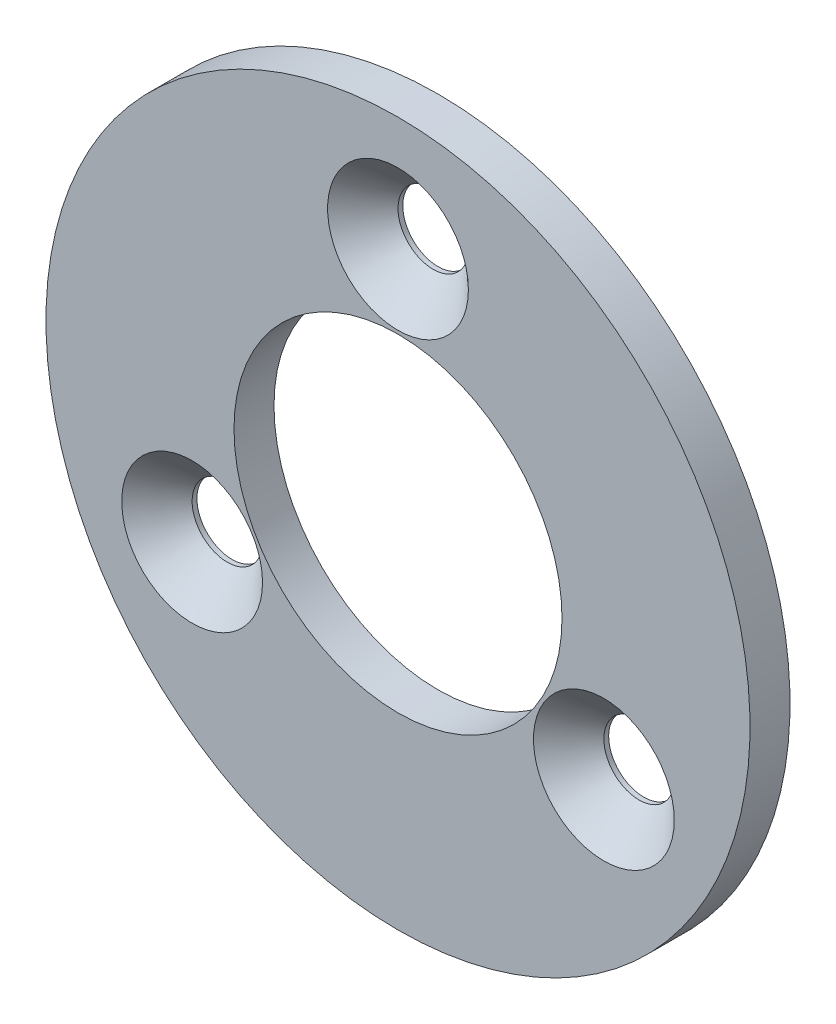
ISO-10303-21;
HEADER;
FILE_DESCRIPTION(('STEP AP214'),'2;1');
FILE_NAME('part.step','',(''),(''),'','','');
FILE_SCHEMA(('AUTOMOTIVE_DESIGN { 1 0 10303 214 1 1 1 1 }'));
ENDSEC;
DATA;
#1=APPLICATION_CONTEXT('core data for automotive mechanical design processes');
#2=APPLICATION_PROTOCOL_DEFINITION('international standard','automotive_design',2000,#1);
#3=PRODUCT_CONTEXT('',#1,'mechanical');
#4=PRODUCT('Part','Part','',(#3));
#5=PRODUCT_RELATED_PRODUCT_CATEGORY('part','',(#4));
#6=PRODUCT_DEFINITION_FORMATION('','',#4);
#7=PRODUCT_DEFINITION_CONTEXT('part definition',#1,'design');
#8=PRODUCT_DEFINITION('design','',#6,#7);
#9=PRODUCT_DEFINITION_SHAPE('','',#8);
#10=(LENGTH_UNIT() NAMED_UNIT(*) SI_UNIT(.MILLI.,.METRE.));
#11=(NAMED_UNIT(*) PLANE_ANGLE_UNIT() SI_UNIT($,.RADIAN.));
#12=(NAMED_UNIT(*) SI_UNIT($,.STERADIAN.) SOLID_ANGLE_UNIT());
#13=UNCERTAINTY_MEASURE_WITH_UNIT(LENGTH_MEASURE(1.E-05),#10,'distance_accuracy_value','');
#14=(GEOMETRIC_REPRESENTATION_CONTEXT(3) GLOBAL_UNCERTAINTY_ASSIGNED_CONTEXT((#13)) GLOBAL_UNIT_ASSIGNED_CONTEXT((#10,
#11,#12)) REPRESENTATION_CONTEXT('',''));
#15=CARTESIAN_POINT('',(0.,0.,0.));
#16=DIRECTION('',(0.,0.,1.));
#17=DIRECTION('',(1.,0.,0.));
#18=AXIS2_PLACEMENT_3D('',#15,#16,#17);
#19=CARTESIAN_POINT('',(0.,7.42820323027551,1.25000000002728));
#20=DIRECTION('',(0.,0.,1.));
#21=DIRECTION('',(1.,0.,0.));
#22=AXIS2_PLACEMENT_3D('',#19,#20,#21);
#23=CONICAL_SURFACE('',#22,2.1999999999025,0.78539816337161);
#24=CARTESIAN_POINT('',(0.,7.42820323027551,0.150000000000011));
#25=DIRECTION('',(0.,0.,1.));
#26=DIRECTION('',(0.,-1.,0.));
#27=AXIS2_PLACEMENT_3D('',#24,#25,#26);
#28=CIRCLE('',#27,1.1);
#29=CARTESIAN_POINT('',(0.,6.32820323027552,0.150000000000011));
#30=VERTEX_POINT('',#29);
#31=EDGE_CURVE('E30',#30,#30,#28,.F.);
#32=ORIENTED_EDGE('',*,*,#31,.T.);
#33=EDGE_LOOP('',(#32));
#34=FACE_BOUND('',#33,.T.);
#35=CARTESIAN_POINT('',(0.,7.42820323027551,1.25000000002728));
#36=DIRECTION('',(0.,0.,1.));
#37=DIRECTION('',(1.,0.,0.));
#38=AXIS2_PLACEMENT_3D('',#35,#36,#37);
#39=CIRCLE('',#38,2.1999999999025);
#40=CARTESIAN_POINT('',(2.1999999999025,7.42820323027551,1.25000000002728));
#41=VERTEX_POINT('',#40);
#42=EDGE_CURVE('E18',#41,#41,#39,.F.);
#43=ORIENTED_EDGE('',*,*,#42,.F.);
#44=EDGE_LOOP('',(#43));
#45=FACE_BOUND('',#44,.T.);
#46=ADVANCED_FACE('F15',(#34,#45),#23,.F.);
#47=CARTESIAN_POINT('',(6.43301270189222,-3.71410161513775,1.2499999999136));
#48=DIRECTION('',(0.,0.,1.));
#49=DIRECTION('',(1.,0.,0.));
#50=AXIS2_PLACEMENT_3D('',#47,#48,#49);
#51=CONICAL_SURFACE('',#50,2.19999999985821,0.785398163397448);
#52=CARTESIAN_POINT('',(6.43301270189222,-3.71410161513775,0.150000000000011));
#53=DIRECTION('',(0.,0.,1.));
#54=DIRECTION('',(0.,-1.,0.));
#55=AXIS2_PLACEMENT_3D('',#52,#53,#54);
#56=CIRCLE('',#55,1.1);
#57=CARTESIAN_POINT('',(6.43301270189222,-4.81410161513775,0.150000000000011));
#58=VERTEX_POINT('',#57);
#59=EDGE_CURVE('E109',#58,#58,#56,.F.);
#60=ORIENTED_EDGE('',*,*,#59,.T.);
#61=EDGE_LOOP('',(#60));
#62=FACE_BOUND('',#61,.T.);
#63=CARTESIAN_POINT('',(6.43301270189222,-3.71410161513775,1.24999999995789));
#64=DIRECTION('',(0.,0.,1.));
#65=DIRECTION('',(1.,0.,0.));
#66=AXIS2_PLACEMENT_3D('',#63,#64,#65);
#67=CIRCLE('',#66,2.1999999999025);
#68=CARTESIAN_POINT('',(8.63301270179473,-3.71410161513775,1.24999999995789));
#69=VERTEX_POINT('',#68);
#70=EDGE_CURVE('E50',#69,#69,#67,.F.);
#71=ORIENTED_EDGE('',*,*,#70,.F.);
#72=EDGE_LOOP('',(#71));
#73=FACE_BOUND('',#72,.T.);
#74=ADVANCED_FACE('F60',(#62,#73),#51,.F.);
#75=CARTESIAN_POINT('',(-6.43301270189222,-3.71410161513776,1.24999999997044));
#76=DIRECTION('',(0.,0.,1.));
#77=DIRECTION('',(1.,0.,0.));
#78=AXIS2_PLACEMENT_3D('',#75,#76,#77);
#79=CONICAL_SURFACE('',#78,2.20000000000363,0.785398163423286);
#80=CARTESIAN_POINT('',(-6.43301270189222,-3.71410161513776,0.150000000000011));
#81=DIRECTION('',(0.,0.,1.));
#82=DIRECTION('',(0.,-1.,0.));
#83=AXIS2_PLACEMENT_3D('',#80,#81,#82);
#84=CIRCLE('',#83,1.1);
#85=CARTESIAN_POINT('',(-6.43301270189222,-4.81410161513775,0.150000000000011));
#86=VERTEX_POINT('',#85);
#87=EDGE_CURVE('E47',#86,#86,#84,.F.);
#88=ORIENTED_EDGE('',*,*,#87,.T.);
#89=EDGE_LOOP('',(#88));
#90=FACE_BOUND('',#89,.T.);
#91=CARTESIAN_POINT('',(-6.43301270189222,-3.71410161513776,1.25000000003984));
#92=DIRECTION('',(0.,0.,1.));
#93=DIRECTION('',(1.,0.,0.));
#94=AXIS2_PLACEMENT_3D('',#91,#92,#93);
#95=CIRCLE('',#94,2.20000000007303);
#96=CARTESIAN_POINT('',(-4.23301270181919,-3.71410161513776,1.25000000003984));
#97=VERTEX_POINT('',#96);
#98=EDGE_CURVE('E48',#97,#97,#95,.F.);
#99=ORIENTED_EDGE('',*,*,#98,.F.);
#100=EDGE_LOOP('',(#99));
#101=FACE_BOUND('',#100,.T.);
#102=ADVANCED_FACE('F66',(#90,#101),#79,.F.);
#103=CARTESIAN_POINT('',(0.,0.,1.25));
#104=DIRECTION('',(0.,0.,1.));
#105=DIRECTION('',(0.,-1.,0.));
#106=AXIS2_PLACEMENT_3D('',#103,#104,#105);
#107=PLANE('',#106);
#108=CARTESIAN_POINT('',(0.,0.,1.25));
#109=DIRECTION('',(0.,0.,-1.));
#110=DIRECTION('',(0.,1.,0.));
#111=AXIS2_PLACEMENT_3D('',#108,#109,#110);
#112=CIRCLE('',#111,5.125);
#113=CARTESIAN_POINT('',(0.,5.125,1.25));
#114=VERTEX_POINT('',#113);
#115=EDGE_CURVE('E41',#114,#114,#112,.T.);
#116=ORIENTED_EDGE('',*,*,#115,.T.);
#117=EDGE_LOOP('',(#116));
#118=FACE_BOUND('',#117,.T.);
#119=CARTESIAN_POINT('',(0.,0.,1.25));
#120=DIRECTION('',(0.,0.,-1.));
#121=DIRECTION('',(0.,1.,0.));
#122=AXIS2_PLACEMENT_3D('',#119,#120,#121);
#123=CIRCLE('',#122,11.);
#124=CARTESIAN_POINT('',(0.,11.,1.25));
#125=VERTEX_POINT('',#124);
#126=EDGE_CURVE('E44',#125,#125,#123,.T.);
#127=ORIENTED_EDGE('',*,*,#126,.F.);
#128=EDGE_LOOP('',(#127));
#129=FACE_BOUND('',#128,.T.);
#130=ORIENTED_EDGE('',*,*,#98,.T.);
#131=EDGE_LOOP('',(#130));
#132=FACE_BOUND('',#131,.T.);
#133=ORIENTED_EDGE('',*,*,#70,.T.);
#134=EDGE_LOOP('',(#133));
#135=FACE_BOUND('',#134,.T.);
#136=ORIENTED_EDGE('',*,*,#42,.T.);
#137=EDGE_LOOP('',(#136));
#138=FACE_BOUND('',#137,.T.);
#139=ADVANCED_FACE('F57',(#118,#129,#132,#135,#138),#107,.T.);
#140=CARTESIAN_POINT('',(0.,7.42820323027551,1.25));
#141=DIRECTION('',(0.,0.,1.));
#142=DIRECTION('',(0.,-1.,0.));
#143=AXIS2_PLACEMENT_3D('',#140,#141,#142);
#144=CYLINDRICAL_SURFACE('',#143,1.1);
#145=CARTESIAN_POINT('',(0.,7.42820323027551,0.));
#146=DIRECTION('',(0.,0.,1.));
#147=DIRECTION('',(0.,-1.,0.));
#148=AXIS2_PLACEMENT_3D('',#145,#146,#147);
#149=CIRCLE('',#148,1.1);
#150=CARTESIAN_POINT('',(0.,6.32820323027552,0.));
#151=VERTEX_POINT('',#150);
#152=EDGE_CURVE('E38',#151,#151,#149,.F.);
#153=ORIENTED_EDGE('',*,*,#152,.T.);
#154=EDGE_LOOP('',(#153));
#155=FACE_BOUND('',#154,.T.);
#156=ORIENTED_EDGE('',*,*,#31,.F.);
#157=EDGE_LOOP('',(#156));
#158=FACE_BOUND('',#157,.T.);
#159=ADVANCED_FACE('F91',(#155,#158),#144,.F.);
#160=CARTESIAN_POINT('',(6.43301270189222,-3.71410161513775,1.25));
#161=DIRECTION('',(0.,0.,1.));
#162=DIRECTION('',(0.,-1.,0.));
#163=AXIS2_PLACEMENT_3D('',#160,#161,#162);
#164=CYLINDRICAL_SURFACE('',#163,1.1);
#165=CARTESIAN_POINT('',(6.43301270189222,-3.71410161513775,0.));
#166=DIRECTION('',(0.,0.,1.));
#167=DIRECTION('',(0.,-1.,0.));
#168=AXIS2_PLACEMENT_3D('',#165,#166,#167);
#169=CIRCLE('',#168,1.1);
#170=CARTESIAN_POINT('',(6.43301270189222,-4.81410161513775,0.));
#171=VERTEX_POINT('',#170);
#172=EDGE_CURVE('E35',#171,#171,#169,.F.);
#173=ORIENTED_EDGE('',*,*,#172,.T.);
#174=EDGE_LOOP('',(#173));
#175=FACE_BOUND('',#174,.T.);
#176=ORIENTED_EDGE('',*,*,#59,.F.);
#177=EDGE_LOOP('',(#176));
#178=FACE_BOUND('',#177,.T.);
#179=ADVANCED_FACE('F87',(#175,#178),#164,.F.);
#180=CARTESIAN_POINT('',(-6.43301270189222,-3.71410161513776,1.25));
#181=DIRECTION('',(0.,0.,1.));
#182=DIRECTION('',(0.,-1.,0.));
#183=AXIS2_PLACEMENT_3D('',#180,#181,#182);
#184=CYLINDRICAL_SURFACE('',#183,1.1);
#185=CARTESIAN_POINT('',(-6.43301270189222,-3.71410161513776,0.));
#186=DIRECTION('',(0.,0.,1.));
#187=DIRECTION('',(0.,-1.,0.));
#188=AXIS2_PLACEMENT_3D('',#185,#186,#187);
#189=CIRCLE('',#188,1.1);
#190=CARTESIAN_POINT('',(-6.43301270189222,-4.81410161513775,0.));
#191=VERTEX_POINT('',#190);
#192=EDGE_CURVE('E27',#191,#191,#189,.F.);
#193=ORIENTED_EDGE('',*,*,#192,.T.);
#194=EDGE_LOOP('',(#193));
#195=FACE_BOUND('',#194,.T.);
#196=ORIENTED_EDGE('',*,*,#87,.F.);
#197=EDGE_LOOP('',(#196));
#198=FACE_BOUND('',#197,.T.);
#199=ADVANCED_FACE('F83',(#195,#198),#184,.F.);
#200=CARTESIAN_POINT('',(0.,0.,1.25));
#201=DIRECTION('',(0.,0.,-1.));
#202=DIRECTION('',(0.,1.,0.));
#203=AXIS2_PLACEMENT_3D('',#200,#201,#202);
#204=CYLINDRICAL_SURFACE('',#203,11.);
#205=ORIENTED_EDGE('',*,*,#126,.T.);
#206=EDGE_LOOP('',(#205));
#207=FACE_BOUND('',#206,.T.);
#208=CARTESIAN_POINT('',(0.,0.,0.));
#209=DIRECTION('',(0.,0.,-1.));
#210=DIRECTION('',(0.,1.,0.));
#211=AXIS2_PLACEMENT_3D('',#208,#209,#210);
#212=CIRCLE('',#211,11.);
#213=CARTESIAN_POINT('',(0.,11.,0.));
#214=VERTEX_POINT('',#213);
#215=EDGE_CURVE('E22',#214,#214,#212,.F.);
#216=ORIENTED_EDGE('',*,*,#215,.T.);
#217=EDGE_LOOP('',(#216));
#218=FACE_BOUND('',#217,.T.);
#219=ADVANCED_FACE('F77',(#207,#218),#204,.T.);
#220=CARTESIAN_POINT('',(0.,0.,1.25));
#221=DIRECTION('',(0.,0.,-1.));
#222=DIRECTION('',(0.,1.,0.));
#223=AXIS2_PLACEMENT_3D('',#220,#221,#222);
#224=CYLINDRICAL_SURFACE('',#223,5.125);
#225=CARTESIAN_POINT('',(0.,0.,0.));
#226=DIRECTION('',(0.,0.,-1.));
#227=DIRECTION('',(0.,1.,0.));
#228=AXIS2_PLACEMENT_3D('',#225,#226,#227);
#229=CIRCLE('',#228,5.125);
#230=CARTESIAN_POINT('',(0.,5.125,0.));
#231=VERTEX_POINT('',#230);
#232=EDGE_CURVE('E10',#231,#231,#229,.T.);
#233=ORIENTED_EDGE('',*,*,#232,.T.);
#234=EDGE_LOOP('',(#233));
#235=FACE_BOUND('',#234,.T.);
#236=ORIENTED_EDGE('',*,*,#115,.F.);
#237=EDGE_LOOP('',(#236));
#238=FACE_BOUND('',#237,.T.);
#239=ADVANCED_FACE('F71',(#235,#238),#224,.F.);
#240=CARTESIAN_POINT('',(0.,0.,0.));
#241=DIRECTION('',(0.,0.,1.));
#242=DIRECTION('',(0.,-1.,0.));
#243=AXIS2_PLACEMENT_3D('',#240,#241,#242);
#244=PLANE('',#243);
#245=ORIENTED_EDGE('',*,*,#232,.F.);
#246=EDGE_LOOP('',(#245));
#247=FACE_BOUND('',#246,.T.);
#248=ORIENTED_EDGE('',*,*,#215,.F.);
#249=EDGE_LOOP('',(#248));
#250=FACE_BOUND('',#249,.T.);
#251=ORIENTED_EDGE('',*,*,#192,.F.);
#252=EDGE_LOOP('',(#251));
#253=FACE_BOUND('',#252,.T.);
#254=ORIENTED_EDGE('',*,*,#172,.F.);
#255=EDGE_LOOP('',(#254));
#256=FACE_BOUND('',#255,.T.);
#257=ORIENTED_EDGE('',*,*,#152,.F.);
#258=EDGE_LOOP('',(#257));
#259=FACE_BOUND('',#258,.T.);
#260=ADVANCED_FACE('F69',(#247,#250,#253,#256,#259),#244,.F.);
#261=CLOSED_SHELL('',(#46,#74,#102,#139,#159,#179,#199,#219,#239,#260));
#262=MANIFOLD_SOLID_BREP('B1',#261);
#263=ADVANCED_BREP_SHAPE_REPRESENTATION('',(#18,#262),#14);
#264=SHAPE_DEFINITION_REPRESENTATION(#9,#263);
ENDSEC;
END-ISO-10303-21;
